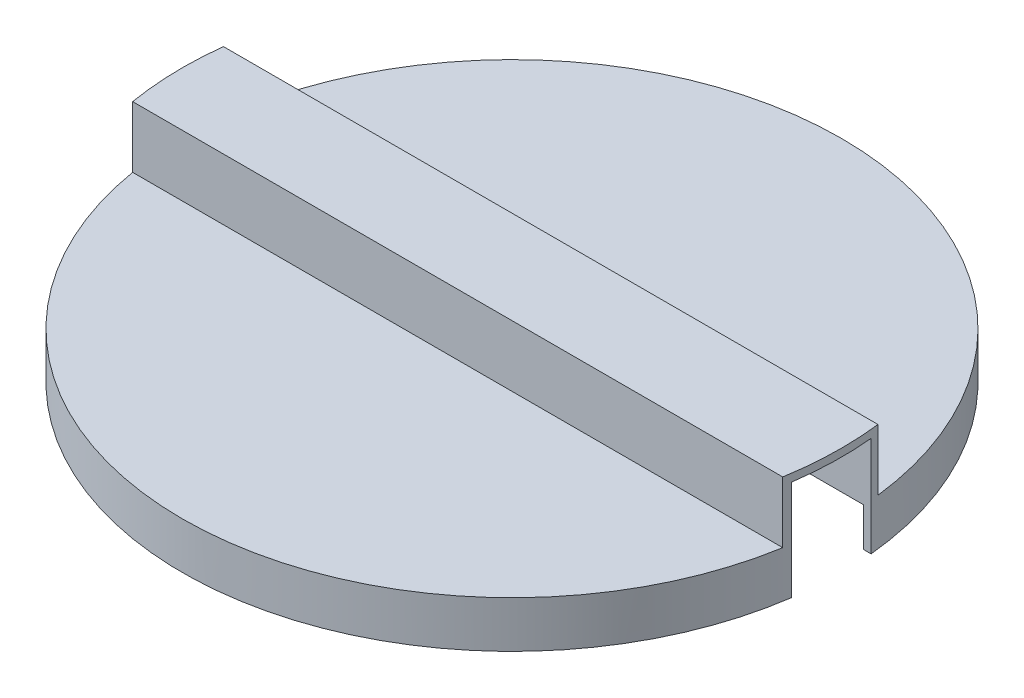
ISO-10303-21;
HEADER;
FILE_DESCRIPTION(('STEP AP214'),'2;1');
FILE_NAME('part.step','',(''),(''),'','','');
FILE_SCHEMA(('AUTOMOTIVE_DESIGN { 1 0 10303 214 1 1 1 1 }'));
ENDSEC;
DATA;
#1=APPLICATION_CONTEXT('core data for automotive mechanical design processes');
#2=APPLICATION_PROTOCOL_DEFINITION('international standard','automotive_design',2000,#1);
#3=PRODUCT_CONTEXT('',#1,'mechanical');
#4=PRODUCT('Part','Part','',(#3));
#5=PRODUCT_RELATED_PRODUCT_CATEGORY('part','',(#4));
#6=PRODUCT_DEFINITION_FORMATION('','',#4);
#7=PRODUCT_DEFINITION_CONTEXT('part definition',#1,'design');
#8=PRODUCT_DEFINITION('design','',#6,#7);
#9=PRODUCT_DEFINITION_SHAPE('','',#8);
#10=(LENGTH_UNIT() NAMED_UNIT(*) SI_UNIT(.MILLI.,.METRE.));
#11=(NAMED_UNIT(*) PLANE_ANGLE_UNIT() SI_UNIT($,.RADIAN.));
#12=(NAMED_UNIT(*) SI_UNIT($,.STERADIAN.) SOLID_ANGLE_UNIT());
#13=UNCERTAINTY_MEASURE_WITH_UNIT(LENGTH_MEASURE(1.E-05),#10,'distance_accuracy_value','');
#14=(GEOMETRIC_REPRESENTATION_CONTEXT(3) GLOBAL_UNCERTAINTY_ASSIGNED_CONTEXT((#13)) GLOBAL_UNIT_ASSIGNED_CONTEXT((#10,
#11,#12)) REPRESENTATION_CONTEXT('',''));
#15=CARTESIAN_POINT('',(0.,0.,0.));
#16=DIRECTION('',(0.,0.,1.));
#17=DIRECTION('',(1.,0.,0.));
#18=AXIS2_PLACEMENT_3D('',#15,#16,#17);
#19=CARTESIAN_POINT('',(0.,0.,0.));
#20=DIRECTION('',(0.,1.,0.));
#21=DIRECTION('',(0.,0.,1.));
#22=AXIS2_PLACEMENT_3D('',#19,#20,#21);
#23=PLANE('',#22);
#24=CARTESIAN_POINT('',(0.,0.,0.));
#25=DIRECTION('',(0.,1.,0.));
#26=DIRECTION('',(0.,0.,-1.));
#27=AXIS2_PLACEMENT_3D('',#24,#25,#26);
#28=CIRCLE('',#27,124.5);
#29=CARTESIAN_POINT('',(-123.191923436563,0.,18.));
#30=VERTEX_POINT('',#29);
#31=CARTESIAN_POINT('',(123.191923436563,0.,18.));
#32=VERTEX_POINT('',#31);
#33=EDGE_CURVE('E159',#30,#32,#28,.T.);
#34=ORIENTED_EDGE('',*,*,#33,.F.);
#35=DIRECTION('',(-1.,0.,0.));
#36=VECTOR('',#35,1.);
#37=CARTESIAN_POINT('',(-126.223016918469,0.,18.));
#38=LINE('',#37,#36);
#39=EDGE_CURVE('E186',#32,#30,#38,.T.);
#40=ORIENTED_EDGE('',*,*,#39,.F.);
#41=EDGE_LOOP('',(#34,#40));
#42=FACE_BOUND('',#41,.T.);
#43=ADVANCED_FACE('F39',(#42),#23,.F.);
#44=CARTESIAN_POINT('',(0.,0.,0.));
#45=DIRECTION('',(0.,1.,0.));
#46=DIRECTION('',(0.,0.,1.));
#47=AXIS2_PLACEMENT_3D('',#44,#45,#46);
#48=PLANE('',#47);
#49=CARTESIAN_POINT('',(0.,0.,0.));
#50=DIRECTION('',(0.,1.,0.));
#51=DIRECTION('',(0.,0.,-1.));
#52=AXIS2_PLACEMENT_3D('',#49,#50,#51);
#53=CIRCLE('',#52,124.556788310055);
#54=CARTESIAN_POINT('',(123.977391140949,0.,-12.0000000000001));
#55=VERTEX_POINT('',#54);
#56=CARTESIAN_POINT('',(-123.977391140949,0.,-12.));
#57=VERTEX_POINT('',#56);
#58=EDGE_CURVE('E173',#55,#57,#53,.T.);
#59=ORIENTED_EDGE('',*,*,#58,.F.);
#60=DIRECTION('',(1.,0.,0.));
#61=VECTOR('',#60,1.);
#62=CARTESIAN_POINT('',(-126.93403798824,0.,-12.));
#63=LINE('',#62,#61);
#64=EDGE_CURVE('E226',#57,#55,#63,.T.);
#65=ORIENTED_EDGE('',*,*,#64,.F.);
#66=EDGE_LOOP('',(#59,#65));
#67=FACE_BOUND('',#66,.T.);
#68=ADVANCED_FACE('F297',(#67),#48,.F.);
#69=CARTESIAN_POINT('',(0.,23.7,0.));
#70=DIRECTION('',(0.,1.,0.));
#71=DIRECTION('',(0.,0.,1.));
#72=AXIS2_PLACEMENT_3D('',#69,#70,#71);
#73=PLANE('',#72);
#74=DIRECTION('',(-1.,0.,0.));
#75=VECTOR('',#74,1.);
#76=CARTESIAN_POINT('',(-126.223016918469,23.7,18.));
#77=LINE('',#76,#75);
#78=CARTESIAN_POINT('',(126.223016918469,23.7,18.));
#79=VERTEX_POINT('',#78);
#80=CARTESIAN_POINT('',(-126.223016918469,23.7,18.));
#81=VERTEX_POINT('',#80);
#82=EDGE_CURVE('E183',#79,#81,#77,.T.);
#83=ORIENTED_EDGE('',*,*,#82,.T.);
#84=CARTESIAN_POINT('',(0.,23.7,0.));
#85=DIRECTION('',(0.,1.,0.));
#86=DIRECTION('',(0.,0.,1.));
#87=AXIS2_PLACEMENT_3D('',#84,#85,#86);
#88=CIRCLE('',#87,127.5);
#89=CARTESIAN_POINT('',(-126.93403798824,23.7,-12.));
#90=VERTEX_POINT('',#89);
#91=EDGE_CURVE('E139',#90,#81,#88,.T.);
#92=ORIENTED_EDGE('',*,*,#91,.F.);
#93=DIRECTION('',(1.,0.,0.));
#94=VECTOR('',#93,1.);
#95=CARTESIAN_POINT('',(-126.93403798824,23.7,-12.));
#96=LINE('',#95,#94);
#97=CARTESIAN_POINT('',(126.93403798824,23.7,-12.));
#98=VERTEX_POINT('',#97);
#99=EDGE_CURVE('E254',#90,#98,#96,.T.);
#100=ORIENTED_EDGE('',*,*,#99,.T.);
#101=CARTESIAN_POINT('',(0.,23.7,0.));
#102=DIRECTION('',(0.,1.,0.));
#103=DIRECTION('',(0.,0.,1.));
#104=AXIS2_PLACEMENT_3D('',#101,#102,#103);
#105=CIRCLE('',#104,127.5);
#106=EDGE_CURVE('E275',#79,#98,#105,.T.);
#107=ORIENTED_EDGE('',*,*,#106,.F.);
#108=EDGE_LOOP('',(#83,#92,#100,#107));
#109=FACE_BOUND('',#108,.T.);
#110=ADVANCED_FACE('F295',(#109),#73,.F.);
#111=CARTESIAN_POINT('',(0.,3.,0.));
#112=DIRECTION('',(0.,-1.,0.));
#113=DIRECTION('',(0.,0.,-1.));
#114=AXIS2_PLACEMENT_3D('',#111,#112,#113);
#115=CYLINDRICAL_SURFACE('',#114,127.5);
#116=CARTESIAN_POINT('',(0.,3.,0.));
#117=DIRECTION('',(0.,1.,0.));
#118=DIRECTION('',(0.,0.,1.));
#119=AXIS2_PLACEMENT_3D('',#116,#117,#118);
#120=CIRCLE('',#119,127.5);
#121=CARTESIAN_POINT('',(-125.758697512339,3.,21.));
#122=VERTEX_POINT('',#121);
#123=CARTESIAN_POINT('',(125.758697512339,3.,21.));
#124=VERTEX_POINT('',#123);
#125=EDGE_CURVE('E144',#122,#124,#120,.T.);
#126=ORIENTED_EDGE('',*,*,#125,.F.);
#127=DIRECTION('',(0.,-1.,0.));
#128=VECTOR('',#127,1.);
#129=CARTESIAN_POINT('',(-125.758697512339,26.7,20.9999999999999));
#130=LINE('',#129,#128);
#131=CARTESIAN_POINT('',(-125.758697512339,26.7,20.9999999999999));
#132=VERTEX_POINT('',#131);
#133=EDGE_CURVE('E255',#132,#122,#130,.T.);
#134=ORIENTED_EDGE('',*,*,#133,.F.);
#135=CARTESIAN_POINT('',(0.,26.7,0.));
#136=DIRECTION('',(0.,1.,0.));
#137=DIRECTION('',(0.,0.,1.));
#138=AXIS2_PLACEMENT_3D('',#135,#136,#137);
#139=CIRCLE('',#138,127.5);
#140=CARTESIAN_POINT('',(-126.614572621006,26.7,-15.));
#141=VERTEX_POINT('',#140);
#142=EDGE_CURVE('E261',#141,#132,#139,.T.);
#143=ORIENTED_EDGE('',*,*,#142,.F.);
#144=DIRECTION('',(0.,-1.,0.));
#145=VECTOR('',#144,1.);
#146=CARTESIAN_POINT('',(-126.614572621006,23.7,-15.));
#147=LINE('',#146,#145);
#148=CARTESIAN_POINT('',(-126.614572621006,3.,-15.));
#149=VERTEX_POINT('',#148);
#150=EDGE_CURVE('E251',#141,#149,#147,.T.);
#151=ORIENTED_EDGE('',*,*,#150,.T.);
#152=CARTESIAN_POINT('',(0.,3.,0.));
#153=DIRECTION('',(0.,1.,0.));
#154=DIRECTION('',(0.,0.,1.));
#155=AXIS2_PLACEMENT_3D('',#152,#153,#154);
#156=CIRCLE('',#155,127.5);
#157=CARTESIAN_POINT('',(126.614572621006,3.,-15.));
#158=VERTEX_POINT('',#157);
#159=EDGE_CURVE('E229',#158,#149,#156,.T.);
#160=ORIENTED_EDGE('',*,*,#159,.F.);
#161=DIRECTION('',(0.,-1.,0.));
#162=VECTOR('',#161,1.);
#163=CARTESIAN_POINT('',(126.614572621006,23.7,-15.));
#164=LINE('',#163,#162);
#165=CARTESIAN_POINT('',(126.614572621006,26.7,-15.));
#166=VERTEX_POINT('',#165);
#167=EDGE_CURVE('E230',#166,#158,#164,.T.);
#168=ORIENTED_EDGE('',*,*,#167,.F.);
#169=CARTESIAN_POINT('',(0.,26.7,0.));
#170=DIRECTION('',(0.,1.,0.));
#171=DIRECTION('',(0.,0.,1.));
#172=AXIS2_PLACEMENT_3D('',#169,#170,#171);
#173=CIRCLE('',#172,127.5);
#174=CARTESIAN_POINT('',(125.758697512339,26.7,21.));
#175=VERTEX_POINT('',#174);
#176=EDGE_CURVE('E282',#175,#166,#173,.T.);
#177=ORIENTED_EDGE('',*,*,#176,.F.);
#178=DIRECTION('',(0.,-1.,0.));
#179=VECTOR('',#178,1.);
#180=CARTESIAN_POINT('',(125.758697512339,26.7,21.));
#181=LINE('',#180,#179);
#182=EDGE_CURVE('E271',#175,#124,#181,.T.);
#183=ORIENTED_EDGE('',*,*,#182,.T.);
#184=EDGE_LOOP('',(#126,#134,#143,#151,#160,#168,#177,#183));
#185=FACE_BOUND('',#184,.T.);
#186=DIRECTION('',(0.,-1.,0.));
#187=VECTOR('',#186,1.);
#188=CARTESIAN_POINT('',(126.93403798824,3.,-12.));
#189=LINE('',#188,#187);
#190=CARTESIAN_POINT('',(126.93403798824,-15.,-12.));
#191=VERTEX_POINT('',#190);
#192=EDGE_CURVE('E49',#98,#191,#189,.T.);
#193=ORIENTED_EDGE('',*,*,#192,.T.);
#194=CARTESIAN_POINT('',(0.,-15.,0.));
#195=DIRECTION('',(0.,-1.,0.));
#196=DIRECTION('',(0.,0.,-1.));
#197=AXIS2_PLACEMENT_3D('',#194,#195,#196);
#198=CIRCLE('',#197,127.5);
#199=CARTESIAN_POINT('',(-126.93403798824,-15.,-12.));
#200=VERTEX_POINT('',#199);
#201=EDGE_CURVE('E168',#200,#191,#198,.T.);
#202=ORIENTED_EDGE('',*,*,#201,.F.);
#203=DIRECTION('',(0.,-1.,0.));
#204=VECTOR('',#203,1.);
#205=CARTESIAN_POINT('',(-126.93403798824,3.,-12.));
#206=LINE('',#205,#204);
#207=EDGE_CURVE('E11',#90,#200,#206,.T.);
#208=ORIENTED_EDGE('',*,*,#207,.F.);
#209=ORIENTED_EDGE('',*,*,#91,.T.);
#210=DIRECTION('',(0.,-1.,0.));
#211=VECTOR('',#210,1.);
#212=CARTESIAN_POINT('',(-126.223016918469,3.,18.));
#213=LINE('',#212,#211);
#214=CARTESIAN_POINT('',(-126.223016918469,-15.,18.));
#215=VERTEX_POINT('',#214);
#216=EDGE_CURVE('E134',#81,#215,#213,.T.);
#217=ORIENTED_EDGE('',*,*,#216,.T.);
#218=CARTESIAN_POINT('',(0.,-15.,0.));
#219=DIRECTION('',(0.,-1.,0.));
#220=DIRECTION('',(0.,0.,-1.));
#221=AXIS2_PLACEMENT_3D('',#218,#219,#220);
#222=CIRCLE('',#221,127.5);
#223=CARTESIAN_POINT('',(126.223016918469,-15.,18.));
#224=VERTEX_POINT('',#223);
#225=EDGE_CURVE('E137',#224,#215,#222,.T.);
#226=ORIENTED_EDGE('',*,*,#225,.F.);
#227=DIRECTION('',(0.,-1.,0.));
#228=VECTOR('',#227,1.);
#229=CARTESIAN_POINT('',(126.223016918469,3.,18.));
#230=LINE('',#229,#228);
#231=EDGE_CURVE('E143',#79,#224,#230,.T.);
#232=ORIENTED_EDGE('',*,*,#231,.F.);
#233=ORIENTED_EDGE('',*,*,#106,.T.);
#234=EDGE_LOOP('',(#193,#202,#208,#209,#217,#226,#232,#233));
#235=FACE_BOUND('',#234,.T.);
#236=ADVANCED_FACE('F41',(#185,#235),#115,.T.);
#237=CARTESIAN_POINT('',(-126.93403798824,3.,-12.));
#238=DIRECTION('',(0.,0.,-1.));
#239=DIRECTION('',(-1.,0.,0.));
#240=AXIS2_PLACEMENT_3D('',#237,#238,#239);
#241=PLANE('',#240);
#242=ORIENTED_EDGE('',*,*,#207,.T.);
#243=DIRECTION('',(-1.,0.,0.));
#244=VECTOR('',#243,1.);
#245=CARTESIAN_POINT('',(-126.93403798824,-15.,-12.));
#246=LINE('',#245,#244);
#247=CARTESIAN_POINT('',(-123.977391140949,-15.,-12.));
#248=VERTEX_POINT('',#247);
#249=EDGE_CURVE('E179',#248,#200,#246,.T.);
#250=ORIENTED_EDGE('',*,*,#249,.F.);
#251=DIRECTION('',(0.,1.,0.));
#252=VECTOR('',#251,1.);
#253=CARTESIAN_POINT('',(-123.977391140949,-15.,-12.));
#254=LINE('',#253,#252);
#255=EDGE_CURVE('E65',#248,#57,#254,.T.);
#256=ORIENTED_EDGE('',*,*,#255,.T.);
#257=ORIENTED_EDGE('',*,*,#64,.T.);
#258=DIRECTION('',(0.,1.,0.));
#259=VECTOR('',#258,1.);
#260=CARTESIAN_POINT('',(123.977391140949,-15.,-12.0000000000001));
#261=LINE('',#260,#259);
#262=CARTESIAN_POINT('',(123.977391140949,-15.,-12.0000000000001));
#263=VERTEX_POINT('',#262);
#264=EDGE_CURVE('E191',#263,#55,#261,.T.);
#265=ORIENTED_EDGE('',*,*,#264,.F.);
#266=DIRECTION('',(-1.,0.,0.));
#267=VECTOR('',#266,1.);
#268=CARTESIAN_POINT('',(123.977391140949,-15.,-12.));
#269=LINE('',#268,#267);
#270=EDGE_CURVE('E172',#191,#263,#269,.T.);
#271=ORIENTED_EDGE('',*,*,#270,.F.);
#272=ORIENTED_EDGE('',*,*,#192,.F.);
#273=ORIENTED_EDGE('',*,*,#99,.F.);
#274=EDGE_LOOP('',(#242,#250,#256,#257,#265,#271,#272,#273));
#275=FACE_BOUND('',#274,.T.);
#276=ADVANCED_FACE('F294',(#275),#241,.F.);
#277=CARTESIAN_POINT('',(0.,3.,0.));
#278=DIRECTION('',(0.,1.,0.));
#279=DIRECTION('',(0.,0.,1.));
#280=AXIS2_PLACEMENT_3D('',#277,#278,#279);
#281=PLANE('',#280);
#282=DIRECTION('',(-1.,0.,0.));
#283=VECTOR('',#282,1.);
#284=CARTESIAN_POINT('',(-126.614572621006,3.,-15.));
#285=LINE('',#284,#283);
#286=EDGE_CURVE('E244',#158,#149,#285,.T.);
#287=ORIENTED_EDGE('',*,*,#286,.F.);
#288=ORIENTED_EDGE('',*,*,#159,.T.);
#289=EDGE_LOOP('',(#287,#288));
#290=FACE_BOUND('',#289,.T.);
#291=ADVANCED_FACE('F243',(#290),#281,.T.);
#292=CARTESIAN_POINT('',(-126.614572621006,23.7,-15.));
#293=DIRECTION('',(0.,0.,1.));
#294=DIRECTION('',(1.,0.,0.));
#295=AXIS2_PLACEMENT_3D('',#292,#293,#294);
#296=PLANE('',#295);
#297=ORIENTED_EDGE('',*,*,#286,.T.);
#298=ORIENTED_EDGE('',*,*,#150,.F.);
#299=DIRECTION('',(-1.,0.,0.));
#300=VECTOR('',#299,1.);
#301=CARTESIAN_POINT('',(-126.614572621006,26.7,-15.));
#302=LINE('',#301,#300);
#303=EDGE_CURVE('E274',#166,#141,#302,.T.);
#304=ORIENTED_EDGE('',*,*,#303,.F.);
#305=ORIENTED_EDGE('',*,*,#167,.T.);
#306=EDGE_LOOP('',(#297,#298,#304,#305));
#307=FACE_BOUND('',#306,.T.);
#308=ADVANCED_FACE('F249',(#307),#296,.F.);
#309=CARTESIAN_POINT('',(-125.758697512339,26.7,20.9999999999999));
#310=DIRECTION('',(0.,0.,-1.));
#311=DIRECTION('',(-1.,0.,0.));
#312=AXIS2_PLACEMENT_3D('',#309,#310,#311);
#313=PLANE('',#312);
#314=ORIENTED_EDGE('',*,*,#133,.T.);
#315=DIRECTION('',(1.,0.,0.));
#316=VECTOR('',#315,1.);
#317=CARTESIAN_POINT('',(-125.758697512339,3.,21.));
#318=LINE('',#317,#316);
#319=EDGE_CURVE('E187',#122,#124,#318,.T.);
#320=ORIENTED_EDGE('',*,*,#319,.T.);
#321=ORIENTED_EDGE('',*,*,#182,.F.);
#322=DIRECTION('',(1.,0.,0.));
#323=VECTOR('',#322,1.);
#324=CARTESIAN_POINT('',(-125.758697512339,26.7,20.9999999999999));
#325=LINE('',#324,#323);
#326=EDGE_CURVE('E286',#132,#175,#325,.T.);
#327=ORIENTED_EDGE('',*,*,#326,.F.);
#328=EDGE_LOOP('',(#314,#320,#321,#327));
#329=FACE_BOUND('',#328,.T.);
#330=ADVANCED_FACE('F319',(#329),#313,.F.);
#331=CARTESIAN_POINT('',(0.,26.7,0.));
#332=DIRECTION('',(0.,1.,0.));
#333=DIRECTION('',(0.,0.,1.));
#334=AXIS2_PLACEMENT_3D('',#331,#332,#333);
#335=PLANE('',#334);
#336=ORIENTED_EDGE('',*,*,#142,.T.);
#337=ORIENTED_EDGE('',*,*,#326,.T.);
#338=ORIENTED_EDGE('',*,*,#176,.T.);
#339=ORIENTED_EDGE('',*,*,#303,.T.);
#340=EDGE_LOOP('',(#336,#337,#338,#339));
#341=FACE_BOUND('',#340,.T.);
#342=ADVANCED_FACE('F317',(#341),#335,.T.);
#343=CARTESIAN_POINT('',(-126.223016918469,3.,18.));
#344=DIRECTION('',(0.,0.,1.));
#345=DIRECTION('',(1.,0.,0.));
#346=AXIS2_PLACEMENT_3D('',#343,#344,#345);
#347=PLANE('',#346);
#348=ORIENTED_EDGE('',*,*,#231,.T.);
#349=DIRECTION('',(1.,0.,0.));
#350=VECTOR('',#349,1.);
#351=CARTESIAN_POINT('',(123.191923436563,-15.,18.));
#352=LINE('',#351,#350);
#353=CARTESIAN_POINT('',(123.191923436563,-15.,18.));
#354=VERTEX_POINT('',#353);
#355=EDGE_CURVE('E157',#354,#224,#352,.T.);
#356=ORIENTED_EDGE('',*,*,#355,.F.);
#357=DIRECTION('',(0.,1.,0.));
#358=VECTOR('',#357,1.);
#359=CARTESIAN_POINT('',(123.191923436563,-15.,18.));
#360=LINE('',#359,#358);
#361=EDGE_CURVE('E57',#354,#32,#360,.T.);
#362=ORIENTED_EDGE('',*,*,#361,.T.);
#363=ORIENTED_EDGE('',*,*,#39,.T.);
#364=DIRECTION('',(0.,1.,0.));
#365=VECTOR('',#364,1.);
#366=CARTESIAN_POINT('',(-123.191923436563,-15.,18.));
#367=LINE('',#366,#365);
#368=CARTESIAN_POINT('',(-123.191923436563,-15.,18.));
#369=VERTEX_POINT('',#368);
#370=EDGE_CURVE('E149',#369,#30,#367,.T.);
#371=ORIENTED_EDGE('',*,*,#370,.F.);
#372=DIRECTION('',(1.,0.,0.));
#373=VECTOR('',#372,1.);
#374=CARTESIAN_POINT('',(-126.223016918469,-15.,18.));
#375=LINE('',#374,#373);
#376=EDGE_CURVE('E147',#215,#369,#375,.T.);
#377=ORIENTED_EDGE('',*,*,#376,.F.);
#378=ORIENTED_EDGE('',*,*,#216,.F.);
#379=ORIENTED_EDGE('',*,*,#82,.F.);
#380=EDGE_LOOP('',(#348,#356,#362,#363,#371,#377,#378,#379));
#381=FACE_BOUND('',#380,.T.);
#382=ADVANCED_FACE('F148',(#381),#347,.F.);
#383=CARTESIAN_POINT('',(0.,3.,0.));
#384=DIRECTION('',(0.,1.,0.));
#385=DIRECTION('',(0.,0.,1.));
#386=AXIS2_PLACEMENT_3D('',#383,#384,#385);
#387=PLANE('',#386);
#388=ORIENTED_EDGE('',*,*,#319,.F.);
#389=ORIENTED_EDGE('',*,*,#125,.T.);
#390=EDGE_LOOP('',(#388,#389));
#391=FACE_BOUND('',#390,.T.);
#392=ADVANCED_FACE('F314',(#391),#387,.T.);
#393=CARTESIAN_POINT('',(0.,-15.,0.));
#394=DIRECTION('',(0.,1.,0.));
#395=DIRECTION('',(0.,0.,1.));
#396=AXIS2_PLACEMENT_3D('',#393,#394,#395);
#397=CYLINDRICAL_SURFACE('',#396,124.556788310055);
#398=ORIENTED_EDGE('',*,*,#58,.T.);
#399=ORIENTED_EDGE('',*,*,#255,.F.);
#400=CARTESIAN_POINT('',(0.,-15.,0.));
#401=DIRECTION('',(0.,1.,0.));
#402=DIRECTION('',(0.,0.,-1.));
#403=AXIS2_PLACEMENT_3D('',#400,#401,#402);
#404=CIRCLE('',#403,124.556788310055);
#405=EDGE_CURVE('E176',#263,#248,#404,.T.);
#406=ORIENTED_EDGE('',*,*,#405,.F.);
#407=ORIENTED_EDGE('',*,*,#264,.T.);
#408=EDGE_LOOP('',(#398,#399,#406,#407));
#409=FACE_BOUND('',#408,.T.);
#410=ADVANCED_FACE('F329',(#409),#397,.F.);
#411=CARTESIAN_POINT('',(0.,-15.,0.));
#412=DIRECTION('',(0.,-1.,0.));
#413=DIRECTION('',(0.,0.,-1.));
#414=AXIS2_PLACEMENT_3D('',#411,#412,#413);
#415=PLANE('',#414);
#416=ORIENTED_EDGE('',*,*,#201,.T.);
#417=ORIENTED_EDGE('',*,*,#270,.T.);
#418=ORIENTED_EDGE('',*,*,#405,.T.);
#419=ORIENTED_EDGE('',*,*,#249,.T.);
#420=EDGE_LOOP('',(#416,#417,#418,#419));
#421=FACE_BOUND('',#420,.T.);
#422=ADVANCED_FACE('F333',(#421),#415,.T.);
#423=CARTESIAN_POINT('',(0.,-15.,0.));
#424=DIRECTION('',(0.,1.,0.));
#425=DIRECTION('',(0.,0.,1.));
#426=AXIS2_PLACEMENT_3D('',#423,#424,#425);
#427=CYLINDRICAL_SURFACE('',#426,124.5);
#428=ORIENTED_EDGE('',*,*,#33,.T.);
#429=ORIENTED_EDGE('',*,*,#361,.F.);
#430=CARTESIAN_POINT('',(0.,-15.,0.));
#431=DIRECTION('',(0.,1.,0.));
#432=DIRECTION('',(0.,0.,-1.));
#433=AXIS2_PLACEMENT_3D('',#430,#431,#432);
#434=CIRCLE('',#433,124.5);
#435=EDGE_CURVE('E153',#369,#354,#434,.T.);
#436=ORIENTED_EDGE('',*,*,#435,.F.);
#437=ORIENTED_EDGE('',*,*,#370,.T.);
#438=EDGE_LOOP('',(#428,#429,#436,#437));
#439=FACE_BOUND('',#438,.T.);
#440=ADVANCED_FACE('F337',(#439),#427,.F.);
#441=CARTESIAN_POINT('',(0.,-15.,0.));
#442=DIRECTION('',(0.,-1.,0.));
#443=DIRECTION('',(0.,0.,-1.));
#444=AXIS2_PLACEMENT_3D('',#441,#442,#443);
#445=PLANE('',#444);
#446=ORIENTED_EDGE('',*,*,#225,.T.);
#447=ORIENTED_EDGE('',*,*,#376,.T.);
#448=ORIENTED_EDGE('',*,*,#435,.T.);
#449=ORIENTED_EDGE('',*,*,#355,.T.);
#450=EDGE_LOOP('',(#446,#447,#448,#449));
#451=FACE_BOUND('',#450,.T.);
#452=ADVANCED_FACE('F156',(#451),#445,.T.);
#453=CLOSED_SHELL('',(#43,#68,#110,#236,#276,#291,#308,#330,#342,#382,#392,#410,#422,#440,#452));
#454=MANIFOLD_SOLID_BREP('B2',#453);
#455=ADVANCED_BREP_SHAPE_REPRESENTATION('',(#18,#454),#14);
#456=SHAPE_DEFINITION_REPRESENTATION(#9,#455);
ENDSEC;
END-ISO-10303-21;
